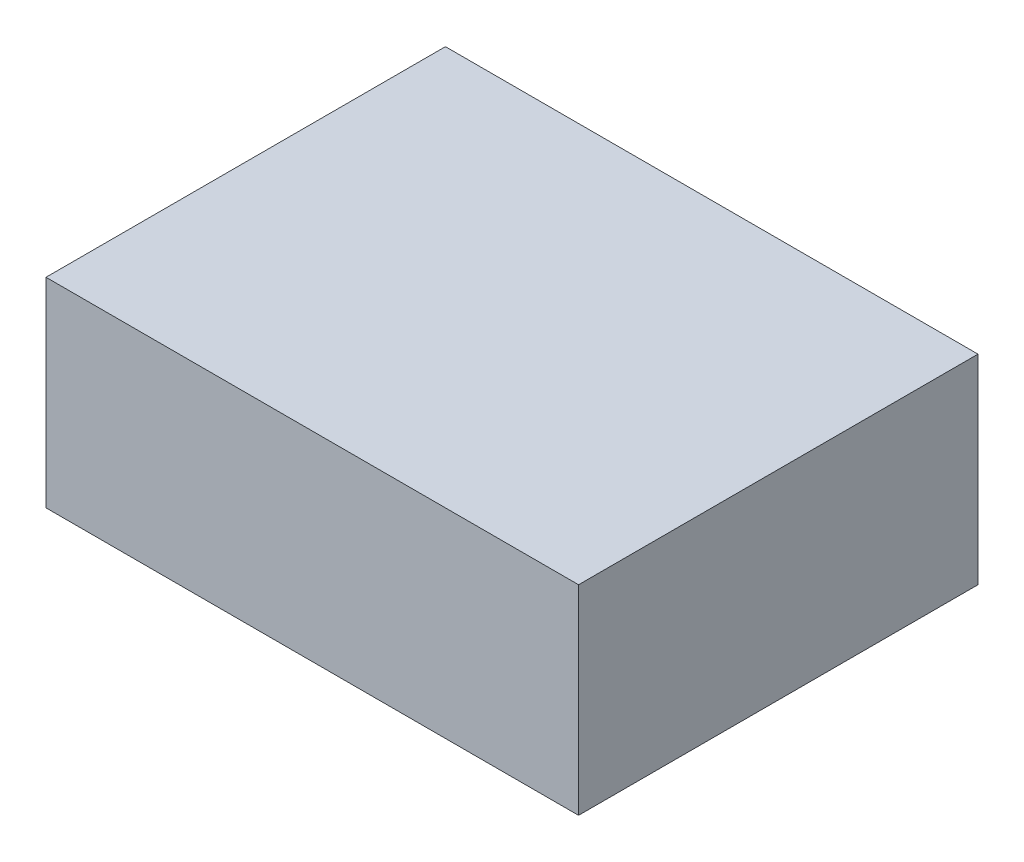
ISO-10303-21;
HEADER;
FILE_DESCRIPTION(('STEP AP214'),'2;1');
FILE_NAME('part.step','',(''),(''),'','','');
FILE_SCHEMA(('AUTOMOTIVE_DESIGN { 1 0 10303 214 1 1 1 1 }'));
ENDSEC;
DATA;
#1=APPLICATION_CONTEXT('core data for automotive mechanical design processes');
#2=APPLICATION_PROTOCOL_DEFINITION('international standard','automotive_design',2000,#1);
#3=PRODUCT_CONTEXT('',#1,'mechanical');
#4=PRODUCT('Part','Part','',(#3));
#5=PRODUCT_RELATED_PRODUCT_CATEGORY('part','',(#4));
#6=PRODUCT_DEFINITION_FORMATION('','',#4);
#7=PRODUCT_DEFINITION_CONTEXT('part definition',#1,'design');
#8=PRODUCT_DEFINITION('design','',#6,#7);
#9=PRODUCT_DEFINITION_SHAPE('','',#8);
#10=(LENGTH_UNIT() NAMED_UNIT(*) SI_UNIT(.MILLI.,.METRE.));
#11=(NAMED_UNIT(*) PLANE_ANGLE_UNIT() SI_UNIT($,.RADIAN.));
#12=(NAMED_UNIT(*) SI_UNIT($,.STERADIAN.) SOLID_ANGLE_UNIT());
#13=UNCERTAINTY_MEASURE_WITH_UNIT(LENGTH_MEASURE(1.E-05),#10,'distance_accuracy_value','');
#14=(GEOMETRIC_REPRESENTATION_CONTEXT(3) GLOBAL_UNCERTAINTY_ASSIGNED_CONTEXT((#13)) GLOBAL_UNIT_ASSIGNED_CONTEXT((#10,
#11,#12)) REPRESENTATION_CONTEXT('',''));
#15=CARTESIAN_POINT('',(0.,0.,0.));
#16=DIRECTION('',(0.,0.,1.));
#17=DIRECTION('',(1.,0.,0.));
#18=AXIS2_PLACEMENT_3D('',#15,#16,#17);
#19=CARTESIAN_POINT('',(101.6,76.2,-76.2));
#20=DIRECTION('',(-1.,0.,0.));
#21=DIRECTION('',(0.,0.,1.));
#22=AXIS2_PLACEMENT_3D('',#19,#20,#21);
#23=PLANE('',#22);
#24=DIRECTION('',(0.,0.,-1.));
#25=VECTOR('',#24,1.);
#26=CARTESIAN_POINT('',(101.6,0.,-76.2));
#27=LINE('',#26,#25);
#28=CARTESIAN_POINT('',(101.6,0.,76.2));
#29=VERTEX_POINT('',#28);
#30=CARTESIAN_POINT('',(101.6,0.,-76.2));
#31=VERTEX_POINT('',#30);
#32=EDGE_CURVE('E151',#29,#31,#27,.T.);
#33=ORIENTED_EDGE('',*,*,#32,.T.);
#34=DIRECTION('',(0.,-1.,0.));
#35=VECTOR('',#34,1.);
#36=CARTESIAN_POINT('',(101.6,76.2,-76.2));
#37=LINE('',#36,#35);
#38=CARTESIAN_POINT('',(101.6,76.2,-76.2));
#39=VERTEX_POINT('',#38);
#40=EDGE_CURVE('E11',#39,#31,#37,.T.);
#41=ORIENTED_EDGE('',*,*,#40,.F.);
#42=DIRECTION('',(0.,0.,-1.));
#43=VECTOR('',#42,1.);
#44=CARTESIAN_POINT('',(101.6,76.2,-76.2));
#45=LINE('',#44,#43);
#46=CARTESIAN_POINT('',(101.6,76.2,76.2));
#47=VERTEX_POINT('',#46);
#48=EDGE_CURVE('E154',#47,#39,#45,.T.);
#49=ORIENTED_EDGE('',*,*,#48,.F.);
#50=DIRECTION('',(0.,-1.,0.));
#51=VECTOR('',#50,1.);
#52=CARTESIAN_POINT('',(101.6,76.2,76.2));
#53=LINE('',#52,#51);
#54=EDGE_CURVE('E160',#47,#29,#53,.T.);
#55=ORIENTED_EDGE('',*,*,#54,.T.);
#56=EDGE_LOOP('',(#33,#41,#49,#55));
#57=FACE_BOUND('',#56,.T.);
#58=ADVANCED_FACE('F36',(#57),#23,.F.);
#59=CARTESIAN_POINT('',(-101.6,76.2,-76.2));
#60=DIRECTION('',(0.,0.,1.));
#61=DIRECTION('',(1.,0.,0.));
#62=AXIS2_PLACEMENT_3D('',#59,#60,#61);
#63=PLANE('',#62);
#64=DIRECTION('',(-1.,0.,0.));
#65=VECTOR('',#64,1.);
#66=CARTESIAN_POINT('',(-101.6,0.,-76.2));
#67=LINE('',#66,#65);
#68=CARTESIAN_POINT('',(-101.6,0.,-76.2));
#69=VERTEX_POINT('',#68);
#70=EDGE_CURVE('E163',#31,#69,#67,.T.);
#71=ORIENTED_EDGE('',*,*,#70,.T.);
#72=DIRECTION('',(0.,-1.,0.));
#73=VECTOR('',#72,1.);
#74=CARTESIAN_POINT('',(-101.6,76.2,-76.2));
#75=LINE('',#74,#73);
#76=CARTESIAN_POINT('',(-101.6,76.2,-76.2));
#77=VERTEX_POINT('',#76);
#78=EDGE_CURVE('E43',#77,#69,#75,.T.);
#79=ORIENTED_EDGE('',*,*,#78,.F.);
#80=DIRECTION('',(-1.,0.,0.));
#81=VECTOR('',#80,1.);
#82=CARTESIAN_POINT('',(-101.6,76.2,-76.2));
#83=LINE('',#82,#81);
#84=EDGE_CURVE('E87',#39,#77,#83,.T.);
#85=ORIENTED_EDGE('',*,*,#84,.F.);
#86=ORIENTED_EDGE('',*,*,#40,.T.);
#87=EDGE_LOOP('',(#71,#79,#85,#86));
#88=FACE_BOUND('',#87,.T.);
#89=ADVANCED_FACE('F191',(#88),#63,.F.);
#90=CARTESIAN_POINT('',(-101.6,76.2,-76.2));
#91=DIRECTION('',(1.,0.,0.));
#92=DIRECTION('',(0.,0.,-1.));
#93=AXIS2_PLACEMENT_3D('',#90,#91,#92);
#94=PLANE('',#93);
#95=DIRECTION('',(0.,0.,-1.));
#96=VECTOR('',#95,1.);
#97=CARTESIAN_POINT('',(-101.6,63.5,-63.5));
#98=LINE('',#97,#96);
#99=CARTESIAN_POINT('',(-101.6,63.5,63.5));
#100=VERTEX_POINT('',#99);
#101=CARTESIAN_POINT('',(-101.6,63.5,-63.5));
#102=VERTEX_POINT('',#101);
#103=EDGE_CURVE('E138',#100,#102,#98,.T.);
#104=ORIENTED_EDGE('',*,*,#103,.F.);
#105=DIRECTION('',(0.,1.,0.));
#106=VECTOR('',#105,1.);
#107=CARTESIAN_POINT('',(-101.6,63.5,63.5));
#108=LINE('',#107,#106);
#109=CARTESIAN_POINT('',(-101.6,38.1,63.5));
#110=VERTEX_POINT('',#109);
#111=EDGE_CURVE('E50',#110,#100,#108,.T.);
#112=ORIENTED_EDGE('',*,*,#111,.F.);
#113=DIRECTION('',(0.,0.,1.));
#114=VECTOR('',#113,1.);
#115=CARTESIAN_POINT('',(-101.6,38.1,-63.5));
#116=LINE('',#115,#114);
#117=CARTESIAN_POINT('',(-101.6,38.1,-63.5));
#118=VERTEX_POINT('',#117);
#119=EDGE_CURVE('E129',#118,#110,#116,.T.);
#120=ORIENTED_EDGE('',*,*,#119,.F.);
#121=DIRECTION('',(0.,-1.,0.));
#122=VECTOR('',#121,1.);
#123=CARTESIAN_POINT('',(-101.6,63.5,-63.5));
#124=LINE('',#123,#122);
#125=EDGE_CURVE('E132',#102,#118,#124,.T.);
#126=ORIENTED_EDGE('',*,*,#125,.F.);
#127=EDGE_LOOP('',(#104,#112,#120,#126));
#128=FACE_BOUND('',#127,.T.);
#129=DIRECTION('',(0.,0.,1.));
#130=VECTOR('',#129,1.);
#131=CARTESIAN_POINT('',(-101.6,0.,-76.2));
#132=LINE('',#131,#130);
#133=CARTESIAN_POINT('',(-101.6,0.,76.2));
#134=VERTEX_POINT('',#133);
#135=EDGE_CURVE('E165',#69,#134,#132,.T.);
#136=ORIENTED_EDGE('',*,*,#135,.T.);
#137=DIRECTION('',(0.,-1.,0.));
#138=VECTOR('',#137,1.);
#139=CARTESIAN_POINT('',(-101.6,76.2,76.2));
#140=LINE('',#139,#138);
#141=CARTESIAN_POINT('',(-101.6,76.2,76.2));
#142=VERTEX_POINT('',#141);
#143=EDGE_CURVE('E169',#142,#134,#140,.T.);
#144=ORIENTED_EDGE('',*,*,#143,.F.);
#145=DIRECTION('',(0.,0.,1.));
#146=VECTOR('',#145,1.);
#147=CARTESIAN_POINT('',(-101.6,76.2,-76.2));
#148=LINE('',#147,#146);
#149=EDGE_CURVE('E157',#77,#142,#148,.T.);
#150=ORIENTED_EDGE('',*,*,#149,.F.);
#151=ORIENTED_EDGE('',*,*,#78,.T.);
#152=EDGE_LOOP('',(#136,#144,#150,#151));
#153=FACE_BOUND('',#152,.T.);
#154=ADVANCED_FACE('F174',(#128,#153),#94,.F.);
#155=CARTESIAN_POINT('',(-101.6,76.2,76.2));
#156=DIRECTION('',(0.,0.,-1.));
#157=DIRECTION('',(-1.,0.,0.));
#158=AXIS2_PLACEMENT_3D('',#155,#156,#157);
#159=PLANE('',#158);
#160=DIRECTION('',(1.,0.,0.));
#161=VECTOR('',#160,1.);
#162=CARTESIAN_POINT('',(-101.6,0.,76.2));
#163=LINE('',#162,#161);
#164=EDGE_CURVE('E80',#134,#29,#163,.T.);
#165=ORIENTED_EDGE('',*,*,#164,.T.);
#166=ORIENTED_EDGE('',*,*,#54,.F.);
#167=DIRECTION('',(1.,0.,0.));
#168=VECTOR('',#167,1.);
#169=CARTESIAN_POINT('',(-101.6,76.2,76.2));
#170=LINE('',#169,#168);
#171=EDGE_CURVE('E59',#142,#47,#170,.T.);
#172=ORIENTED_EDGE('',*,*,#171,.F.);
#173=ORIENTED_EDGE('',*,*,#143,.T.);
#174=EDGE_LOOP('',(#165,#166,#172,#173));
#175=FACE_BOUND('',#174,.T.);
#176=ADVANCED_FACE('F182',(#175),#159,.F.);
#177=CARTESIAN_POINT('',(0.,76.2,0.));
#178=DIRECTION('',(0.,1.,0.));
#179=DIRECTION('',(0.,0.,1.));
#180=AXIS2_PLACEMENT_3D('',#177,#178,#179);
#181=PLANE('',#180);
#182=ORIENTED_EDGE('',*,*,#48,.T.);
#183=ORIENTED_EDGE('',*,*,#84,.T.);
#184=ORIENTED_EDGE('',*,*,#149,.T.);
#185=ORIENTED_EDGE('',*,*,#171,.T.);
#186=EDGE_LOOP('',(#182,#183,#184,#185));
#187=FACE_BOUND('',#186,.T.);
#188=ADVANCED_FACE('F184',(#187),#181,.T.);
#189=CARTESIAN_POINT('',(0.,0.,0.));
#190=DIRECTION('',(0.,1.,0.));
#191=DIRECTION('',(0.,0.,1.));
#192=AXIS2_PLACEMENT_3D('',#189,#190,#191);
#193=PLANE('',#192);
#194=CARTESIAN_POINT('',(50.8,0.,0.));
#195=DIRECTION('',(0.,-1.,0.));
#196=DIRECTION('',(0.,0.,-1.));
#197=AXIS2_PLACEMENT_3D('',#194,#195,#196);
#198=CIRCLE('',#197,25.4);
#199=CARTESIAN_POINT('',(50.8,0.,-25.4));
#200=VERTEX_POINT('',#199);
#201=EDGE_CURVE('E144',#200,#200,#198,.T.);
#202=ORIENTED_EDGE('',*,*,#201,.F.);
#203=EDGE_LOOP('',(#202));
#204=FACE_BOUND('',#203,.T.);
#205=ORIENTED_EDGE('',*,*,#32,.F.);
#206=ORIENTED_EDGE('',*,*,#164,.F.);
#207=ORIENTED_EDGE('',*,*,#135,.F.);
#208=ORIENTED_EDGE('',*,*,#70,.F.);
#209=EDGE_LOOP('',(#205,#206,#207,#208));
#210=FACE_BOUND('',#209,.T.);
#211=ADVANCED_FACE('F178',(#204,#210),#193,.F.);
#212=CARTESIAN_POINT('',(50.8,25.4,0.));
#213=DIRECTION('',(0.,-1.,0.));
#214=DIRECTION('',(0.,0.,-1.));
#215=AXIS2_PLACEMENT_3D('',#212,#213,#214);
#216=CYLINDRICAL_SURFACE('',#215,25.4);
#217=CARTESIAN_POINT('',(50.8,25.4,0.));
#218=DIRECTION('',(0.,-1.,0.));
#219=DIRECTION('',(0.,0.,-1.));
#220=AXIS2_PLACEMENT_3D('',#217,#218,#219);
#221=CIRCLE('',#220,25.4);
#222=CARTESIAN_POINT('',(50.8,25.4,-25.4));
#223=VERTEX_POINT('',#222);
#224=EDGE_CURVE('E148',#223,#223,#221,.T.);
#225=ORIENTED_EDGE('',*,*,#224,.F.);
#226=EDGE_LOOP('',(#225));
#227=FACE_BOUND('',#226,.T.);
#228=ORIENTED_EDGE('',*,*,#201,.T.);
#229=EDGE_LOOP('',(#228));
#230=FACE_BOUND('',#229,.T.);
#231=ADVANCED_FACE('F262',(#227,#230),#216,.F.);
#232=CARTESIAN_POINT('',(50.8,25.4,0.));
#233=DIRECTION('',(0.,-1.,0.));
#234=DIRECTION('',(0.,0.,-1.));
#235=AXIS2_PLACEMENT_3D('',#232,#233,#234);
#236=PLANE('',#235);
#237=ORIENTED_EDGE('',*,*,#224,.T.);
#238=EDGE_LOOP('',(#237));
#239=FACE_BOUND('',#238,.T.);
#240=ADVANCED_FACE('F212',(#239),#236,.T.);
#241=CARTESIAN_POINT('',(76.2,63.5,63.5));
#242=DIRECTION('',(0.,0.,1.));
#243=DIRECTION('',(1.,0.,0.));
#244=AXIS2_PLACEMENT_3D('',#241,#242,#243);
#245=PLANE('',#244);
#246=ORIENTED_EDGE('',*,*,#111,.T.);
#247=DIRECTION('',(-1.,0.,0.));
#248=VECTOR('',#247,1.);
#249=CARTESIAN_POINT('',(76.2,63.5,63.5));
#250=LINE('',#249,#248);
#251=CARTESIAN_POINT('',(76.2,63.5,63.5));
#252=VERTEX_POINT('',#251);
#253=EDGE_CURVE('E107',#252,#100,#250,.T.);
#254=ORIENTED_EDGE('',*,*,#253,.F.);
#255=DIRECTION('',(0.,1.,0.));
#256=VECTOR('',#255,1.);
#257=CARTESIAN_POINT('',(76.2,63.5,63.5));
#258=LINE('',#257,#256);
#259=CARTESIAN_POINT('',(76.2,38.1,63.5));
#260=VERTEX_POINT('',#259);
#261=EDGE_CURVE('E111',#260,#252,#258,.T.);
#262=ORIENTED_EDGE('',*,*,#261,.F.);
#263=DIRECTION('',(-1.,0.,0.));
#264=VECTOR('',#263,1.);
#265=CARTESIAN_POINT('',(76.2,38.1,63.5));
#266=LINE('',#265,#264);
#267=EDGE_CURVE('E142',#260,#110,#266,.T.);
#268=ORIENTED_EDGE('',*,*,#267,.T.);
#269=EDGE_LOOP('',(#246,#254,#262,#268));
#270=FACE_BOUND('',#269,.T.);
#271=ADVANCED_FACE('F109',(#270),#245,.F.);
#272=CARTESIAN_POINT('',(76.2,38.1,-63.5));
#273=DIRECTION('',(0.,-1.,0.));
#274=DIRECTION('',(0.,0.,-1.));
#275=AXIS2_PLACEMENT_3D('',#272,#273,#274);
#276=PLANE('',#275);
#277=ORIENTED_EDGE('',*,*,#119,.T.);
#278=ORIENTED_EDGE('',*,*,#267,.F.);
#279=DIRECTION('',(0.,0.,1.));
#280=VECTOR('',#279,1.);
#281=CARTESIAN_POINT('',(76.2,38.1,-63.5));
#282=LINE('',#281,#280);
#283=CARTESIAN_POINT('',(76.2,38.1,-63.5));
#284=VERTEX_POINT('',#283);
#285=EDGE_CURVE('E117',#284,#260,#282,.T.);
#286=ORIENTED_EDGE('',*,*,#285,.F.);
#287=DIRECTION('',(-1.,0.,0.));
#288=VECTOR('',#287,1.);
#289=CARTESIAN_POINT('',(76.2,38.1,-63.5));
#290=LINE('',#289,#288);
#291=EDGE_CURVE('E145',#284,#118,#290,.T.);
#292=ORIENTED_EDGE('',*,*,#291,.T.);
#293=EDGE_LOOP('',(#277,#278,#286,#292));
#294=FACE_BOUND('',#293,.T.);
#295=ADVANCED_FACE('F221',(#294),#276,.F.);
#296=CARTESIAN_POINT('',(76.2,63.5,-63.5));
#297=DIRECTION('',(0.,0.,-1.));
#298=DIRECTION('',(-1.,0.,0.));
#299=AXIS2_PLACEMENT_3D('',#296,#297,#298);
#300=PLANE('',#299);
#301=ORIENTED_EDGE('',*,*,#125,.T.);
#302=ORIENTED_EDGE('',*,*,#291,.F.);
#303=DIRECTION('',(0.,-1.,0.));
#304=VECTOR('',#303,1.);
#305=CARTESIAN_POINT('',(76.2,63.5,-63.5));
#306=LINE('',#305,#304);
#307=CARTESIAN_POINT('',(76.2,63.5,-63.5));
#308=VERTEX_POINT('',#307);
#309=EDGE_CURVE('E125',#308,#284,#306,.T.);
#310=ORIENTED_EDGE('',*,*,#309,.F.);
#311=DIRECTION('',(-1.,0.,0.));
#312=VECTOR('',#311,1.);
#313=CARTESIAN_POINT('',(76.2,63.5,-63.5));
#314=LINE('',#313,#312);
#315=EDGE_CURVE('E116',#308,#102,#314,.T.);
#316=ORIENTED_EDGE('',*,*,#315,.T.);
#317=EDGE_LOOP('',(#301,#302,#310,#316));
#318=FACE_BOUND('',#317,.T.);
#319=ADVANCED_FACE('F230',(#318),#300,.F.);
#320=CARTESIAN_POINT('',(76.2,63.5,-63.5));
#321=DIRECTION('',(0.,1.,0.));
#322=DIRECTION('',(0.,0.,1.));
#323=AXIS2_PLACEMENT_3D('',#320,#321,#322);
#324=PLANE('',#323);
#325=ORIENTED_EDGE('',*,*,#103,.T.);
#326=ORIENTED_EDGE('',*,*,#315,.F.);
#327=DIRECTION('',(0.,0.,-1.));
#328=VECTOR('',#327,1.);
#329=CARTESIAN_POINT('',(76.2,63.5,-63.5));
#330=LINE('',#329,#328);
#331=EDGE_CURVE('E120',#252,#308,#330,.T.);
#332=ORIENTED_EDGE('',*,*,#331,.F.);
#333=ORIENTED_EDGE('',*,*,#253,.T.);
#334=EDGE_LOOP('',(#325,#326,#332,#333));
#335=FACE_BOUND('',#334,.T.);
#336=ADVANCED_FACE('F121',(#335),#324,.F.);
#337=CARTESIAN_POINT('',(76.2,0.,0.));
#338=DIRECTION('',(-1.,0.,0.));
#339=DIRECTION('',(0.,0.,1.));
#340=AXIS2_PLACEMENT_3D('',#337,#338,#339);
#341=PLANE('',#340);
#342=ORIENTED_EDGE('',*,*,#261,.T.);
#343=ORIENTED_EDGE('',*,*,#331,.T.);
#344=ORIENTED_EDGE('',*,*,#309,.T.);
#345=ORIENTED_EDGE('',*,*,#285,.T.);
#346=EDGE_LOOP('',(#342,#343,#344,#345));
#347=FACE_BOUND('',#346,.T.);
#348=ADVANCED_FACE('F127',(#347),#341,.T.);
#349=CLOSED_SHELL('',(#58,#89,#154,#176,#188,#211,#231,#240,#271,#295,#319,#336,#348));
#350=MANIFOLD_SOLID_BREP('B2',#349);
#351=ADVANCED_BREP_SHAPE_REPRESENTATION('',(#18,#350),#14);
#352=SHAPE_DEFINITION_REPRESENTATION(#9,#351);
ENDSEC;
END-ISO-10303-21;
